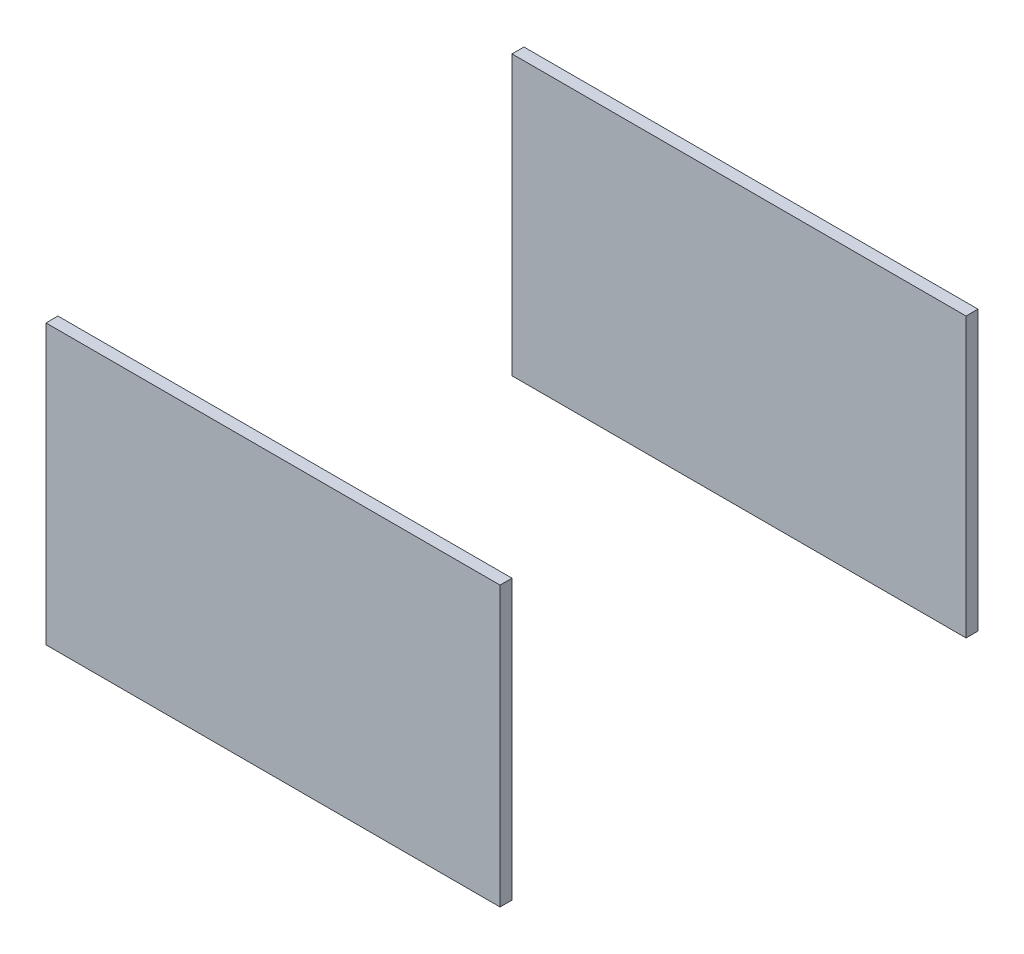
ISO-10303-21;
HEADER;
FILE_DESCRIPTION(('STEP AP214'),'2;1');
FILE_NAME('part.step','',(''),(''),'','','');
FILE_SCHEMA(('AUTOMOTIVE_DESIGN { 1 0 10303 214 1 1 1 1 }'));
ENDSEC;
DATA;
#1=APPLICATION_CONTEXT('core data for automotive mechanical design processes');
#2=APPLICATION_PROTOCOL_DEFINITION('international standard','automotive_design',2000,#1);
#3=PRODUCT_CONTEXT('',#1,'mechanical');
#4=PRODUCT('Part','Part','',(#3));
#5=PRODUCT_RELATED_PRODUCT_CATEGORY('part','',(#4));
#6=PRODUCT_DEFINITION_FORMATION('','',#4);
#7=PRODUCT_DEFINITION_CONTEXT('part definition',#1,'design');
#8=PRODUCT_DEFINITION('design','',#6,#7);
#9=PRODUCT_DEFINITION_SHAPE('','',#8);
#10=(LENGTH_UNIT() NAMED_UNIT(*) SI_UNIT(.MILLI.,.METRE.));
#11=(NAMED_UNIT(*) PLANE_ANGLE_UNIT() SI_UNIT($,.RADIAN.));
#12=(NAMED_UNIT(*) SI_UNIT($,.STERADIAN.) SOLID_ANGLE_UNIT());
#13=UNCERTAINTY_MEASURE_WITH_UNIT(LENGTH_MEASURE(1.E-05),#10,'distance_accuracy_value','');
#14=(GEOMETRIC_REPRESENTATION_CONTEXT(3) GLOBAL_UNCERTAINTY_ASSIGNED_CONTEXT((#13)) GLOBAL_UNIT_ASSIGNED_CONTEXT((#10,
#11,#12)) REPRESENTATION_CONTEXT('',''));
#15=CARTESIAN_POINT('',(0.,0.,0.));
#16=DIRECTION('',(0.,0.,1.));
#17=DIRECTION('',(1.,0.,0.));
#18=AXIS2_PLACEMENT_3D('',#15,#16,#17);
#19=CARTESIAN_POINT('',(-55.452,3.,27.2274203577471));
#20=DIRECTION('',(0.,1.,0.));
#21=DIRECTION('',(0.,0.,1.));
#22=AXIS2_PLACEMENT_3D('',#19,#20,#21);
#23=PLANE('',#22);
#24=DIRECTION('',(1.,0.,0.));
#25=VECTOR('',#24,1.);
#26=CARTESIAN_POINT('',(60.,3.,60.));
#27=LINE('',#26,#25);
#28=CARTESIAN_POINT('',(-57.,3.,60.));
#29=VERTEX_POINT('',#28);
#30=CARTESIAN_POINT('',(57.,3.,60.));
#31=VERTEX_POINT('',#30);
#32=EDGE_CURVE('E100',#29,#31,#27,.T.);
#33=ORIENTED_EDGE('',*,*,#32,.F.);
#34=DIRECTION('',(0.,0.,-1.));
#35=VECTOR('',#34,1.);
#36=CARTESIAN_POINT('',(-57.,3.,-60.));
#37=LINE('',#36,#35);
#38=CARTESIAN_POINT('',(-57.,3.,57.));
#39=VERTEX_POINT('',#38);
#40=EDGE_CURVE('E106',#29,#39,#37,.T.);
#41=ORIENTED_EDGE('',*,*,#40,.T.);
#42=DIRECTION('',(1.,0.,0.));
#43=VECTOR('',#42,1.);
#44=CARTESIAN_POINT('',(-57.,3.,57.));
#45=LINE('',#44,#43);
#46=CARTESIAN_POINT('',(57.,3.,57.));
#47=VERTEX_POINT('',#46);
#48=EDGE_CURVE('E105',#39,#47,#45,.T.);
#49=ORIENTED_EDGE('',*,*,#48,.T.);
#50=DIRECTION('',(0.,0.,1.));
#51=VECTOR('',#50,1.);
#52=CARTESIAN_POINT('',(57.,3.,-60.));
#53=LINE('',#52,#51);
#54=EDGE_CURVE('E46',#47,#31,#53,.T.);
#55=ORIENTED_EDGE('',*,*,#54,.T.);
#56=EDGE_LOOP('',(#33,#41,#49,#55));
#57=FACE_BOUND('',#56,.T.);
#58=ADVANCED_FACE('F42',(#57),#23,.F.);
#59=CARTESIAN_POINT('',(60.,73.,60.));
#60=DIRECTION('',(0.,0.,-1.));
#61=DIRECTION('',(-1.,0.,0.));
#62=AXIS2_PLACEMENT_3D('',#59,#60,#61);
#63=PLANE('',#62);
#64=DIRECTION('',(1.,0.,0.));
#65=VECTOR('',#64,1.);
#66=CARTESIAN_POINT('',(-60.,73.,60.));
#67=LINE('',#66,#65);
#68=CARTESIAN_POINT('',(-57.,73.,60.));
#69=VERTEX_POINT('',#68);
#70=CARTESIAN_POINT('',(57.,73.,60.));
#71=VERTEX_POINT('',#70);
#72=EDGE_CURVE('E87',#69,#71,#67,.T.);
#73=ORIENTED_EDGE('',*,*,#72,.F.);
#74=DIRECTION('',(0.,1.,0.));
#75=VECTOR('',#74,1.);
#76=CARTESIAN_POINT('',(-57.,3.,60.));
#77=LINE('',#76,#75);
#78=EDGE_CURVE('E52',#29,#69,#77,.T.);
#79=ORIENTED_EDGE('',*,*,#78,.F.);
#80=ORIENTED_EDGE('',*,*,#32,.T.);
#81=DIRECTION('',(0.,1.,0.));
#82=VECTOR('',#81,1.);
#83=CARTESIAN_POINT('',(57.,73.,60.));
#84=LINE('',#83,#82);
#85=EDGE_CURVE('E98',#31,#71,#84,.T.);
#86=ORIENTED_EDGE('',*,*,#85,.T.);
#87=EDGE_LOOP('',(#73,#79,#80,#86));
#88=FACE_BOUND('',#87,.T.);
#89=ADVANCED_FACE('F116',(#88),#63,.F.);
#90=CARTESIAN_POINT('',(-57.,73.,57.));
#91=DIRECTION('',(0.,0.,-1.));
#92=DIRECTION('',(-1.,0.,0.));
#93=AXIS2_PLACEMENT_3D('',#90,#91,#92);
#94=PLANE('',#93);
#95=ORIENTED_EDGE('',*,*,#48,.F.);
#96=DIRECTION('',(0.,-1.,0.));
#97=VECTOR('',#96,1.);
#98=CARTESIAN_POINT('',(-57.,73.,57.));
#99=LINE('',#98,#97);
#100=CARTESIAN_POINT('',(-57.,73.,57.));
#101=VERTEX_POINT('',#100);
#102=EDGE_CURVE('E95',#101,#39,#99,.T.);
#103=ORIENTED_EDGE('',*,*,#102,.F.);
#104=DIRECTION('',(1.,0.,0.));
#105=VECTOR('',#104,1.);
#106=CARTESIAN_POINT('',(-57.,73.,57.));
#107=LINE('',#106,#105);
#108=CARTESIAN_POINT('',(57.,73.,57.));
#109=VERTEX_POINT('',#108);
#110=EDGE_CURVE('E88',#101,#109,#107,.T.);
#111=ORIENTED_EDGE('',*,*,#110,.T.);
#112=DIRECTION('',(0.,-1.,0.));
#113=VECTOR('',#112,1.);
#114=CARTESIAN_POINT('',(57.,73.,57.));
#115=LINE('',#114,#113);
#116=EDGE_CURVE('E80',#109,#47,#115,.T.);
#117=ORIENTED_EDGE('',*,*,#116,.T.);
#118=EDGE_LOOP('',(#95,#103,#111,#117));
#119=FACE_BOUND('',#118,.T.);
#120=ADVANCED_FACE('F97',(#119),#94,.T.);
#121=CARTESIAN_POINT('',(-60.,73.,-80.));
#122=DIRECTION('',(0.,-1.,0.));
#123=DIRECTION('',(0.,0.,-1.));
#124=AXIS2_PLACEMENT_3D('',#121,#122,#123);
#125=PLANE('',#124);
#126=ORIENTED_EDGE('',*,*,#110,.F.);
#127=DIRECTION('',(0.,0.,-1.));
#128=VECTOR('',#127,1.);
#129=CARTESIAN_POINT('',(-57.,73.,-60.));
#130=LINE('',#129,#128);
#131=EDGE_CURVE('E12',#69,#101,#130,.T.);
#132=ORIENTED_EDGE('',*,*,#131,.F.);
#133=ORIENTED_EDGE('',*,*,#72,.T.);
#134=DIRECTION('',(0.,0.,-1.));
#135=VECTOR('',#134,1.);
#136=CARTESIAN_POINT('',(57.,73.,-80.));
#137=LINE('',#136,#135);
#138=EDGE_CURVE('E77',#71,#109,#137,.T.);
#139=ORIENTED_EDGE('',*,*,#138,.T.);
#140=EDGE_LOOP('',(#126,#132,#133,#139));
#141=FACE_BOUND('',#140,.T.);
#142=ADVANCED_FACE('F92',(#141),#125,.F.);
#143=CARTESIAN_POINT('',(57.,3.,-60.));
#144=DIRECTION('',(-1.,0.,0.));
#145=DIRECTION('',(0.,0.,1.));
#146=AXIS2_PLACEMENT_3D('',#143,#144,#145);
#147=PLANE('',#146);
#148=ORIENTED_EDGE('',*,*,#54,.F.);
#149=ORIENTED_EDGE('',*,*,#116,.F.);
#150=ORIENTED_EDGE('',*,*,#138,.F.);
#151=ORIENTED_EDGE('',*,*,#85,.F.);
#152=EDGE_LOOP('',(#148,#149,#150,#151));
#153=FACE_BOUND('',#152,.T.);
#154=ADVANCED_FACE('F81',(#153),#147,.F.);
#155=CARTESIAN_POINT('',(-57.,3.,-60.));
#156=DIRECTION('',(1.,0.,0.));
#157=DIRECTION('',(0.,0.,-1.));
#158=AXIS2_PLACEMENT_3D('',#155,#156,#157);
#159=PLANE('',#158);
#160=ORIENTED_EDGE('',*,*,#102,.T.);
#161=ORIENTED_EDGE('',*,*,#40,.F.);
#162=ORIENTED_EDGE('',*,*,#78,.T.);
#163=ORIENTED_EDGE('',*,*,#131,.T.);
#164=EDGE_LOOP('',(#160,#161,#162,#163));
#165=FACE_BOUND('',#164,.T.);
#166=ADVANCED_FACE('F44',(#165),#159,.F.);
#167=CLOSED_SHELL('',(#58,#89,#120,#142,#154,#166));
#168=MANIFOLD_SOLID_BREP('B2',#167);
#169=CARTESIAN_POINT('',(-60.,73.,-80.));
#170=DIRECTION('',(0.,-1.,0.));
#171=DIRECTION('',(0.,0.,-1.));
#172=AXIS2_PLACEMENT_3D('',#169,#170,#171);
#173=PLANE('',#172);
#174=DIRECTION('',(1.,0.,0.));
#175=VECTOR('',#174,1.);
#176=CARTESIAN_POINT('',(60.,73.,-60.));
#177=LINE('',#176,#175);
#178=CARTESIAN_POINT('',(-57.,73.,-60.));
#179=VERTEX_POINT('',#178);
#180=CARTESIAN_POINT('',(57.,73.,-60.));
#181=VERTEX_POINT('',#180);
#182=EDGE_CURVE('E220',#179,#181,#177,.T.);
#183=ORIENTED_EDGE('',*,*,#182,.F.);
#184=DIRECTION('',(0.,0.,1.));
#185=VECTOR('',#184,1.);
#186=CARTESIAN_POINT('',(-57.,73.,-80.));
#187=LINE('',#186,#185);
#188=CARTESIAN_POINT('',(-57.,73.,-57.));
#189=VERTEX_POINT('',#188);
#190=EDGE_CURVE('E40',#179,#189,#187,.T.);
#191=ORIENTED_EDGE('',*,*,#190,.T.);
#192=DIRECTION('',(-1.,0.,0.));
#193=VECTOR('',#192,1.);
#194=CARTESIAN_POINT('',(-57.,73.,-57.));
#195=LINE('',#194,#193);
#196=CARTESIAN_POINT('',(57.,73.,-57.));
#197=VERTEX_POINT('',#196);
#198=EDGE_CURVE('E232',#197,#189,#195,.T.);
#199=ORIENTED_EDGE('',*,*,#198,.F.);
#200=DIRECTION('',(0.,0.,1.));
#201=VECTOR('',#200,1.);
#202=CARTESIAN_POINT('',(57.,73.,-60.));
#203=LINE('',#202,#201);
#204=EDGE_CURVE('E245',#181,#197,#203,.T.);
#205=ORIENTED_EDGE('',*,*,#204,.F.);
#206=EDGE_LOOP('',(#183,#191,#199,#205));
#207=FACE_BOUND('',#206,.T.);
#208=ADVANCED_FACE('F174',(#207),#173,.F.);
#209=CARTESIAN_POINT('',(-55.452,3.,27.2274203577471));
#210=DIRECTION('',(0.,1.,0.));
#211=DIRECTION('',(0.,0.,1.));
#212=AXIS2_PLACEMENT_3D('',#209,#210,#211);
#213=PLANE('',#212);
#214=DIRECTION('',(-1.,0.,0.));
#215=VECTOR('',#214,1.);
#216=CARTESIAN_POINT('',(-57.,3.,-57.));
#217=LINE('',#216,#215);
#218=CARTESIAN_POINT('',(57.,3.,-57.));
#219=VERTEX_POINT('',#218);
#220=CARTESIAN_POINT('',(-57.,3.,-57.));
#221=VERTEX_POINT('',#220);
#222=EDGE_CURVE('E181',#219,#221,#217,.T.);
#223=ORIENTED_EDGE('',*,*,#222,.T.);
#224=DIRECTION('',(0.,0.,-1.));
#225=VECTOR('',#224,1.);
#226=CARTESIAN_POINT('',(-57.,3.,-60.));
#227=LINE('',#226,#225);
#228=CARTESIAN_POINT('',(-57.,3.,-60.));
#229=VERTEX_POINT('',#228);
#230=EDGE_CURVE('E214',#221,#229,#227,.T.);
#231=ORIENTED_EDGE('',*,*,#230,.T.);
#232=DIRECTION('',(-1.,0.,0.));
#233=VECTOR('',#232,1.);
#234=CARTESIAN_POINT('',(60.,3.,-60.));
#235=LINE('',#234,#233);
#236=CARTESIAN_POINT('',(57.,3.,-60.));
#237=VERTEX_POINT('',#236);
#238=EDGE_CURVE('E226',#237,#229,#235,.T.);
#239=ORIENTED_EDGE('',*,*,#238,.F.);
#240=DIRECTION('',(0.,0.,1.));
#241=VECTOR('',#240,1.);
#242=CARTESIAN_POINT('',(57.,3.,-60.));
#243=LINE('',#242,#241);
#244=EDGE_CURVE('E246',#237,#219,#243,.T.);
#245=ORIENTED_EDGE('',*,*,#244,.T.);
#246=EDGE_LOOP('',(#223,#231,#239,#245));
#247=FACE_BOUND('',#246,.T.);
#248=ADVANCED_FACE('F224',(#247),#213,.F.);
#249=CARTESIAN_POINT('',(-57.,73.,-57.));
#250=DIRECTION('',(0.,0.,1.));
#251=DIRECTION('',(1.,0.,0.));
#252=AXIS2_PLACEMENT_3D('',#249,#250,#251);
#253=PLANE('',#252);
#254=ORIENTED_EDGE('',*,*,#222,.F.);
#255=DIRECTION('',(0.,-1.,0.));
#256=VECTOR('',#255,1.);
#257=CARTESIAN_POINT('',(57.,73.,-57.));
#258=LINE('',#257,#256);
#259=EDGE_CURVE('E230',#197,#219,#258,.T.);
#260=ORIENTED_EDGE('',*,*,#259,.F.);
#261=ORIENTED_EDGE('',*,*,#198,.T.);
#262=DIRECTION('',(0.,-1.,0.));
#263=VECTOR('',#262,1.);
#264=CARTESIAN_POINT('',(-57.,73.,-57.));
#265=LINE('',#264,#263);
#266=EDGE_CURVE('E196',#189,#221,#265,.T.);
#267=ORIENTED_EDGE('',*,*,#266,.T.);
#268=EDGE_LOOP('',(#254,#260,#261,#267));
#269=FACE_BOUND('',#268,.T.);
#270=ADVANCED_FACE('F243',(#269),#253,.T.);
#271=CARTESIAN_POINT('',(60.,73.,-60.));
#272=DIRECTION('',(0.,0.,1.));
#273=DIRECTION('',(1.,0.,0.));
#274=AXIS2_PLACEMENT_3D('',#271,#272,#273);
#275=PLANE('',#274);
#276=ORIENTED_EDGE('',*,*,#238,.T.);
#277=DIRECTION('',(0.,1.,0.));
#278=VECTOR('',#277,1.);
#279=CARTESIAN_POINT('',(-57.,3.,-60.));
#280=LINE('',#279,#278);
#281=EDGE_CURVE('E211',#229,#179,#280,.T.);
#282=ORIENTED_EDGE('',*,*,#281,.T.);
#283=ORIENTED_EDGE('',*,*,#182,.T.);
#284=DIRECTION('',(0.,1.,0.));
#285=VECTOR('',#284,1.);
#286=CARTESIAN_POINT('',(57.,3.,-60.));
#287=LINE('',#286,#285);
#288=EDGE_CURVE('E188',#237,#181,#287,.T.);
#289=ORIENTED_EDGE('',*,*,#288,.F.);
#290=EDGE_LOOP('',(#276,#282,#283,#289));
#291=FACE_BOUND('',#290,.T.);
#292=ADVANCED_FACE('F229',(#291),#275,.F.);
#293=CARTESIAN_POINT('',(57.,3.,-60.));
#294=DIRECTION('',(-1.,0.,0.));
#295=DIRECTION('',(0.,0.,1.));
#296=AXIS2_PLACEMENT_3D('',#293,#294,#295);
#297=PLANE('',#296);
#298=ORIENTED_EDGE('',*,*,#259,.T.);
#299=ORIENTED_EDGE('',*,*,#244,.F.);
#300=ORIENTED_EDGE('',*,*,#288,.T.);
#301=ORIENTED_EDGE('',*,*,#204,.T.);
#302=EDGE_LOOP('',(#298,#299,#300,#301));
#303=FACE_BOUND('',#302,.T.);
#304=ADVANCED_FACE('F248',(#303),#297,.F.);
#305=CARTESIAN_POINT('',(-57.,3.,-60.));
#306=DIRECTION('',(1.,0.,0.));
#307=DIRECTION('',(0.,0.,-1.));
#308=AXIS2_PLACEMENT_3D('',#305,#306,#307);
#309=PLANE('',#308);
#310=ORIENTED_EDGE('',*,*,#266,.F.);
#311=ORIENTED_EDGE('',*,*,#190,.F.);
#312=ORIENTED_EDGE('',*,*,#281,.F.);
#313=ORIENTED_EDGE('',*,*,#230,.F.);
#314=EDGE_LOOP('',(#310,#311,#312,#313));
#315=FACE_BOUND('',#314,.T.);
#316=ADVANCED_FACE('F213',(#315),#309,.F.);
#317=CLOSED_SHELL('',(#208,#248,#270,#292,#304,#316));
#318=MANIFOLD_SOLID_BREP('B6',#317);
#319=ADVANCED_BREP_SHAPE_REPRESENTATION('',(#18,#168,#318),#14);
#320=SHAPE_DEFINITION_REPRESENTATION(#9,#319);
ENDSEC;
END-ISO-10303-21;
